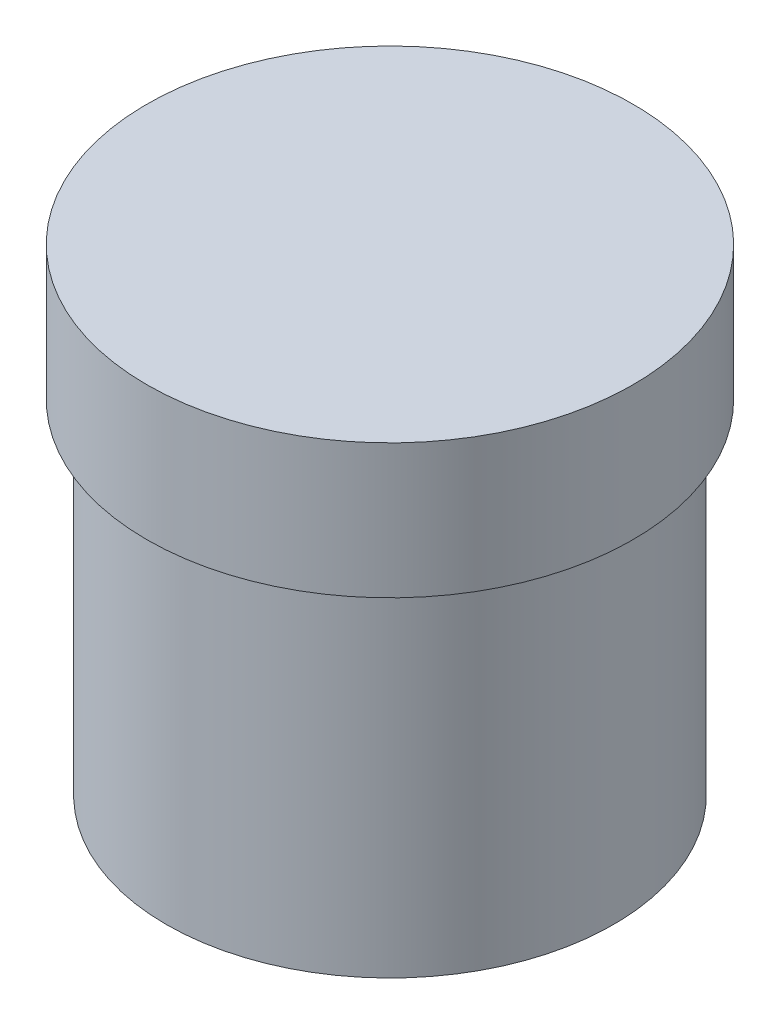
ISO-10303-21;
HEADER;
FILE_DESCRIPTION(('STEP AP214'),'2;1');
FILE_NAME('part.step','',(''),(''),'','','');
FILE_SCHEMA(('AUTOMOTIVE_DESIGN { 1 0 10303 214 1 1 1 1 }'));
ENDSEC;
DATA;
#1=APPLICATION_CONTEXT('core data for automotive mechanical design processes');
#2=APPLICATION_PROTOCOL_DEFINITION('international standard','automotive_design',2000,#1);
#3=PRODUCT_CONTEXT('',#1,'mechanical');
#4=PRODUCT('Part','Part','',(#3));
#5=PRODUCT_RELATED_PRODUCT_CATEGORY('part','',(#4));
#6=PRODUCT_DEFINITION_FORMATION('','',#4);
#7=PRODUCT_DEFINITION_CONTEXT('part definition',#1,'design');
#8=PRODUCT_DEFINITION('design','',#6,#7);
#9=PRODUCT_DEFINITION_SHAPE('','',#8);
#10=(LENGTH_UNIT() NAMED_UNIT(*) SI_UNIT(.MILLI.,.METRE.));
#11=(NAMED_UNIT(*) PLANE_ANGLE_UNIT() SI_UNIT($,.RADIAN.));
#12=(NAMED_UNIT(*) SI_UNIT($,.STERADIAN.) SOLID_ANGLE_UNIT());
#13=UNCERTAINTY_MEASURE_WITH_UNIT(LENGTH_MEASURE(1.E-05),#10,'distance_accuracy_value','');
#14=(GEOMETRIC_REPRESENTATION_CONTEXT(3) GLOBAL_UNCERTAINTY_ASSIGNED_CONTEXT((#13)) GLOBAL_UNIT_ASSIGNED_CONTEXT((#10,
#11,#12)) REPRESENTATION_CONTEXT('',''));
#15=CARTESIAN_POINT('',(0.,0.,0.));
#16=DIRECTION('',(0.,0.,1.));
#17=DIRECTION('',(1.,0.,0.));
#18=AXIS2_PLACEMENT_3D('',#15,#16,#17);
#19=CARTESIAN_POINT('',(0.,9.,0.));
#20=DIRECTION('',(0.,-1.,0.));
#21=DIRECTION('',(0.,0.,-1.));
#22=AXIS2_PLACEMENT_3D('',#19,#20,#21);
#23=CYLINDRICAL_SURFACE('',#22,16.3);
#24=CARTESIAN_POINT('',(0.,9.,0.));
#25=DIRECTION('',(0.,1.,0.));
#26=DIRECTION('',(0.,0.,1.));
#27=AXIS2_PLACEMENT_3D('',#24,#25,#26);
#28=CIRCLE('',#27,16.3);
#29=CARTESIAN_POINT('',(0.,9.,16.3));
#30=VERTEX_POINT('',#29);
#31=EDGE_CURVE('E10',#30,#30,#28,.T.);
#32=ORIENTED_EDGE('',*,*,#31,.F.);
#33=EDGE_LOOP('',(#32));
#34=FACE_BOUND('',#33,.T.);
#35=CARTESIAN_POINT('',(0.,0.,0.));
#36=DIRECTION('',(0.,1.,0.));
#37=DIRECTION('',(0.,0.,1.));
#38=AXIS2_PLACEMENT_3D('',#35,#36,#37);
#39=CIRCLE('',#38,16.3);
#40=CARTESIAN_POINT('',(0.,0.,16.3));
#41=VERTEX_POINT('',#40);
#42=EDGE_CURVE('E35',#41,#41,#39,.T.);
#43=ORIENTED_EDGE('',*,*,#42,.T.);
#44=EDGE_LOOP('',(#43));
#45=FACE_BOUND('',#44,.T.);
#46=ADVANCED_FACE('F32',(#34,#45),#23,.T.);
#47=CARTESIAN_POINT('',(0.,9.,0.));
#48=DIRECTION('',(0.,1.,0.));
#49=DIRECTION('',(0.,0.,1.));
#50=AXIS2_PLACEMENT_3D('',#47,#48,#49);
#51=PLANE('',#50);
#52=ORIENTED_EDGE('',*,*,#31,.T.);
#53=EDGE_LOOP('',(#52));
#54=FACE_BOUND('',#53,.T.);
#55=ADVANCED_FACE('F62',(#54),#51,.T.);
#56=CARTESIAN_POINT('',(0.,0.,0.));
#57=DIRECTION('',(0.,1.,0.));
#58=DIRECTION('',(0.,0.,1.));
#59=AXIS2_PLACEMENT_3D('',#56,#57,#58);
#60=PLANE('',#59);
#61=CARTESIAN_POINT('',(0.,0.,0.));
#62=DIRECTION('',(0.,1.,0.));
#63=DIRECTION('',(0.,0.,1.));
#64=AXIS2_PLACEMENT_3D('',#61,#62,#63);
#65=CIRCLE('',#64,15.);
#66=CARTESIAN_POINT('',(0.,0.,15.));
#67=VERTEX_POINT('',#66);
#68=EDGE_CURVE('E44',#67,#67,#65,.T.);
#69=ORIENTED_EDGE('',*,*,#68,.T.);
#70=EDGE_LOOP('',(#69));
#71=FACE_BOUND('',#70,.T.);
#72=ORIENTED_EDGE('',*,*,#42,.F.);
#73=EDGE_LOOP('',(#72));
#74=FACE_BOUND('',#73,.T.);
#75=ADVANCED_FACE('F59',(#71,#74),#60,.F.);
#76=CARTESIAN_POINT('',(0.,-23.,0.));
#77=DIRECTION('',(0.,1.,0.));
#78=DIRECTION('',(0.,0.,1.));
#79=AXIS2_PLACEMENT_3D('',#76,#77,#78);
#80=CYLINDRICAL_SURFACE('',#79,15.);
#81=CARTESIAN_POINT('',(0.,-23.,0.));
#82=DIRECTION('',(0.,1.,0.));
#83=DIRECTION('',(0.,0.,1.));
#84=AXIS2_PLACEMENT_3D('',#81,#82,#83);
#85=CIRCLE('',#84,15.);
#86=CARTESIAN_POINT('',(0.,-23.,15.));
#87=VERTEX_POINT('',#86);
#88=EDGE_CURVE('E42',#87,#87,#85,.T.);
#89=ORIENTED_EDGE('',*,*,#88,.T.);
#90=EDGE_LOOP('',(#89));
#91=FACE_BOUND('',#90,.T.);
#92=ORIENTED_EDGE('',*,*,#68,.F.);
#93=EDGE_LOOP('',(#92));
#94=FACE_BOUND('',#93,.T.);
#95=ADVANCED_FACE('F50',(#91,#94),#80,.T.);
#96=CARTESIAN_POINT('',(0.,-23.,0.));
#97=DIRECTION('',(0.,1.,0.));
#98=DIRECTION('',(0.,0.,1.));
#99=AXIS2_PLACEMENT_3D('',#96,#97,#98);
#100=PLANE('',#99);
#101=ORIENTED_EDGE('',*,*,#88,.F.);
#102=EDGE_LOOP('',(#101));
#103=FACE_BOUND('',#102,.T.);
#104=ADVANCED_FACE('F53',(#103),#100,.F.);
#105=CLOSED_SHELL('',(#46,#55,#75,#95,#104));
#106=MANIFOLD_SOLID_BREP('B2',#105);
#107=ADVANCED_BREP_SHAPE_REPRESENTATION('',(#18,#106),#14);
#108=SHAPE_DEFINITION_REPRESENTATION(#9,#107);
ENDSEC;
END-ISO-10303-21;
